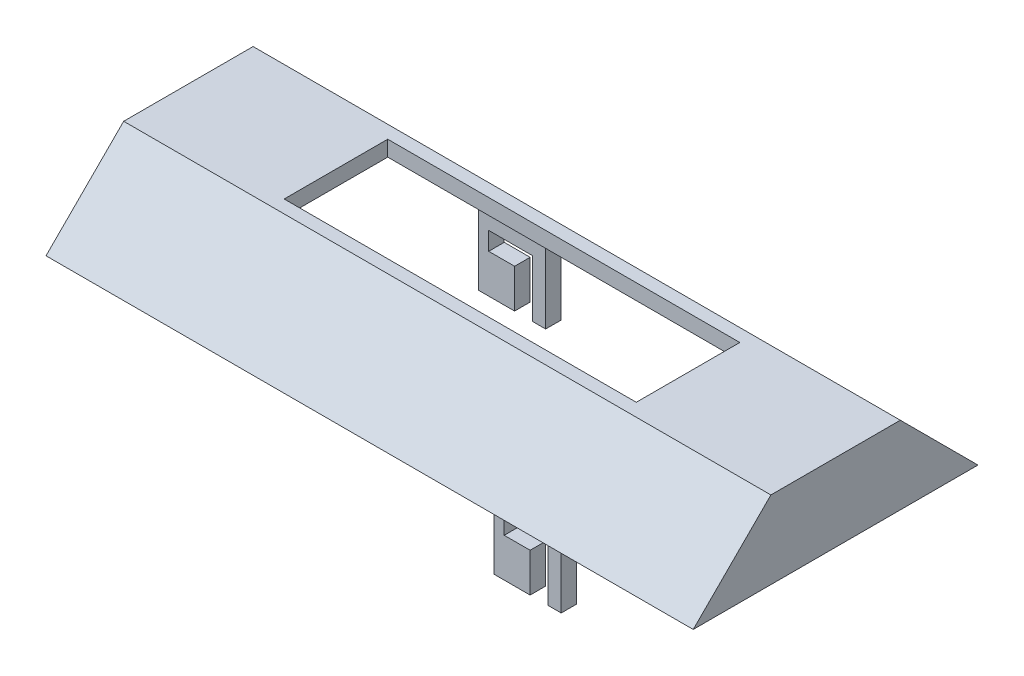
ISO-10303-21;
HEADER;
FILE_DESCRIPTION(('STEP AP214'),'2;1');
FILE_NAME('part.step','',(''),(''),'','','');
FILE_SCHEMA(('AUTOMOTIVE_DESIGN { 1 0 10303 214 1 1 1 1 }'));
ENDSEC;
DATA;
#1=APPLICATION_CONTEXT('core data for automotive mechanical design processes');
#2=APPLICATION_PROTOCOL_DEFINITION('international standard','automotive_design',2000,#1);
#3=PRODUCT_CONTEXT('',#1,'mechanical');
#4=PRODUCT('Part','Part','',(#3));
#5=PRODUCT_RELATED_PRODUCT_CATEGORY('part','',(#4));
#6=PRODUCT_DEFINITION_FORMATION('','',#4);
#7=PRODUCT_DEFINITION_CONTEXT('part definition',#1,'design');
#8=PRODUCT_DEFINITION('design','',#6,#7);
#9=PRODUCT_DEFINITION_SHAPE('','',#8);
#10=(LENGTH_UNIT() NAMED_UNIT(*) SI_UNIT(.MILLI.,.METRE.));
#11=(NAMED_UNIT(*) PLANE_ANGLE_UNIT() SI_UNIT($,.RADIAN.));
#12=(NAMED_UNIT(*) SI_UNIT($,.STERADIAN.) SOLID_ANGLE_UNIT());
#13=UNCERTAINTY_MEASURE_WITH_UNIT(LENGTH_MEASURE(1.E-05),#10,'distance_accuracy_value','');
#14=(GEOMETRIC_REPRESENTATION_CONTEXT(3) GLOBAL_UNCERTAINTY_ASSIGNED_CONTEXT((#13)) GLOBAL_UNIT_ASSIGNED_CONTEXT((#10,
#11,#12)) REPRESENTATION_CONTEXT('',''));
#15=CARTESIAN_POINT('',(0.,0.,0.));
#16=DIRECTION('',(0.,0.,1.));
#17=DIRECTION('',(1.,0.,0.));
#18=AXIS2_PLACEMENT_3D('',#15,#16,#17);
#19=CARTESIAN_POINT('',(0.,12.8786796564404,37.8786796564404));
#20=DIRECTION('',(0.,0.707106781186546,0.707106781186549));
#21=DIRECTION('',(-1.,0.,0.));
#22=AXIS2_PLACEMENT_3D('',#19,#20,#21);
#23=PLANE('',#22);
#24=DIRECTION('',(0.,0.707106781186549,-0.707106781186546));
#25=VECTOR('',#24,1.);
#26=CARTESIAN_POINT('',(83.5,12.8786796564404,37.8786796564404));
#27=LINE('',#26,#25);
#28=CARTESIAN_POINT('',(83.5,0.,50.7573593128807));
#29=VERTEX_POINT('',#28);
#30=CARTESIAN_POINT('',(83.5,1.75735931288066,49.));
#31=VERTEX_POINT('',#30);
#32=EDGE_CURVE('E256',#29,#31,#27,.T.);
#33=ORIENTED_EDGE('',*,*,#32,.F.);
#34=DIRECTION('',(1.,0.,0.));
#35=VECTOR('',#34,1.);
#36=CARTESIAN_POINT('',(0.,0.,50.7573593128807));
#37=LINE('',#36,#35);
#38=CARTESIAN_POINT('',(3.00000000000001,0.,50.7573593128807));
#39=VERTEX_POINT('',#38);
#40=EDGE_CURVE('E258',#39,#29,#37,.T.);
#41=ORIENTED_EDGE('',*,*,#40,.F.);
#42=DIRECTION('',(0.,0.707106781186549,-0.707106781186546));
#43=VECTOR('',#42,1.);
#44=CARTESIAN_POINT('',(3.,12.8786796564404,37.8786796564404));
#45=LINE('',#44,#43);
#46=CARTESIAN_POINT('',(3.,12.,38.7573593128807));
#47=VERTEX_POINT('',#46);
#48=EDGE_CURVE('E338',#39,#47,#45,.T.);
#49=ORIENTED_EDGE('',*,*,#48,.T.);
#50=DIRECTION('',(1.,0.,0.));
#51=VECTOR('',#50,1.);
#52=CARTESIAN_POINT('',(0.,12.,38.7573593128807));
#53=LINE('',#52,#51);
#54=CARTESIAN_POINT('',(122.,12.,38.7573593128807));
#55=VERTEX_POINT('',#54);
#56=EDGE_CURVE('E350',#47,#55,#53,.T.);
#57=ORIENTED_EDGE('',*,*,#56,.T.);
#58=DIRECTION('',(0.,-0.707106781186549,0.707106781186546));
#59=VECTOR('',#58,1.);
#60=CARTESIAN_POINT('',(122.,12.8786796564404,37.8786796564404));
#61=LINE('',#60,#59);
#62=CARTESIAN_POINT('',(122.,0.,50.7573593128807));
#63=VERTEX_POINT('',#62);
#64=EDGE_CURVE('E349',#55,#63,#61,.T.);
#65=ORIENTED_EDGE('',*,*,#64,.T.);
#66=CARTESIAN_POINT('',(96.5,0.,50.7573593128807));
#67=VERTEX_POINT('',#66);
#68=EDGE_CURVE('E278',#67,#63,#37,.T.);
#69=ORIENTED_EDGE('',*,*,#68,.F.);
#70=DIRECTION('',(0.,-0.707106781186549,0.707106781186546));
#71=VECTOR('',#70,1.);
#72=CARTESIAN_POINT('',(96.5,12.8786796564404,37.8786796564404));
#73=LINE('',#72,#71);
#74=CARTESIAN_POINT('',(96.5,1.75735931288066,49.));
#75=VERTEX_POINT('',#74);
#76=EDGE_CURVE('E267',#75,#67,#73,.T.);
#77=ORIENTED_EDGE('',*,*,#76,.F.);
#78=DIRECTION('',(1.,0.,0.));
#79=VECTOR('',#78,1.);
#80=CARTESIAN_POINT('',(0.,1.75735931288066,49.));
#81=LINE('',#80,#79);
#82=EDGE_CURVE('E262',#31,#75,#81,.T.);
#83=ORIENTED_EDGE('',*,*,#82,.F.);
#84=EDGE_LOOP('',(#33,#41,#49,#57,#65,#69,#77,#83));
#85=FACE_BOUND('',#84,.T.);
#86=ADVANCED_FACE('F35',(#85),#23,.F.);
#87=CARTESIAN_POINT('',(0.,12.8786796564404,17.1213203435596));
#88=DIRECTION('',(0.,0.707106781186546,-0.707106781186549));
#89=DIRECTION('',(1.,0.,0.));
#90=AXIS2_PLACEMENT_3D('',#87,#88,#89);
#91=PLANE('',#90);
#92=DIRECTION('',(0.,-0.707106781186549,-0.707106781186546));
#93=VECTOR('',#92,1.);
#94=CARTESIAN_POINT('',(34.5,12.8786796564404,17.1213203435596));
#95=LINE('',#94,#93);
#96=CARTESIAN_POINT('',(34.5,1.75735931288067,6.));
#97=VERTEX_POINT('',#96);
#98=CARTESIAN_POINT('',(34.5,0.,4.24264068711933));
#99=VERTEX_POINT('',#98);
#100=EDGE_CURVE('E510',#97,#99,#95,.T.);
#101=ORIENTED_EDGE('',*,*,#100,.F.);
#102=DIRECTION('',(-1.,0.,0.));
#103=VECTOR('',#102,1.);
#104=CARTESIAN_POINT('',(0.,1.75735931288067,6.));
#105=LINE('',#104,#103);
#106=CARTESIAN_POINT('',(47.5,1.75735931288067,6.));
#107=VERTEX_POINT('',#106);
#108=EDGE_CURVE('E431',#107,#97,#105,.T.);
#109=ORIENTED_EDGE('',*,*,#108,.F.);
#110=DIRECTION('',(0.,0.707106781186549,0.707106781186546));
#111=VECTOR('',#110,1.);
#112=CARTESIAN_POINT('',(47.5,12.8786796564404,17.1213203435596));
#113=LINE('',#112,#111);
#114=CARTESIAN_POINT('',(47.5,0.,4.24264068711933));
#115=VERTEX_POINT('',#114);
#116=EDGE_CURVE('E266',#115,#107,#113,.T.);
#117=ORIENTED_EDGE('',*,*,#116,.F.);
#118=DIRECTION('',(-1.,0.,0.));
#119=VECTOR('',#118,1.);
#120=CARTESIAN_POINT('',(0.,0.,4.24264068711933));
#121=LINE('',#120,#119);
#122=CARTESIAN_POINT('',(122.,0.,4.24264068711933));
#123=VERTEX_POINT('',#122);
#124=EDGE_CURVE('E346',#123,#115,#121,.T.);
#125=ORIENTED_EDGE('',*,*,#124,.F.);
#126=DIRECTION('',(0.,0.707106781186549,0.707106781186546));
#127=VECTOR('',#126,1.);
#128=CARTESIAN_POINT('',(122.,12.8786796564404,17.1213203435596));
#129=LINE('',#128,#127);
#130=CARTESIAN_POINT('',(122.,12.,16.2426406871193));
#131=VERTEX_POINT('',#130);
#132=EDGE_CURVE('E353',#123,#131,#129,.T.);
#133=ORIENTED_EDGE('',*,*,#132,.T.);
#134=DIRECTION('',(-1.,0.,0.));
#135=VECTOR('',#134,1.);
#136=CARTESIAN_POINT('',(0.,12.,16.2426406871193));
#137=LINE('',#136,#135);
#138=CARTESIAN_POINT('',(3.,12.,16.2426406871193));
#139=VERTEX_POINT('',#138);
#140=EDGE_CURVE('E354',#131,#139,#137,.T.);
#141=ORIENTED_EDGE('',*,*,#140,.T.);
#142=DIRECTION('',(0.,-0.707106781186549,-0.707106781186546));
#143=VECTOR('',#142,1.);
#144=CARTESIAN_POINT('',(3.,12.8786796564404,17.1213203435596));
#145=LINE('',#144,#143);
#146=CARTESIAN_POINT('',(3.,0.,4.24264068711933));
#147=VERTEX_POINT('',#146);
#148=EDGE_CURVE('E341',#139,#147,#145,.T.);
#149=ORIENTED_EDGE('',*,*,#148,.T.);
#150=EDGE_CURVE('E365',#99,#147,#121,.T.);
#151=ORIENTED_EDGE('',*,*,#150,.F.);
#152=EDGE_LOOP('',(#101,#109,#117,#125,#133,#141,#149,#151));
#153=FACE_BOUND('',#152,.T.);
#154=ADVANCED_FACE('F579',(#153),#91,.F.);
#155=CARTESIAN_POINT('',(47.5,-13.,6.));
#156=DIRECTION('',(0.,0.,-1.));
#157=DIRECTION('',(-1.,0.,0.));
#158=AXIS2_PLACEMENT_3D('',#155,#156,#157);
#159=PLANE('',#158);
#160=DIRECTION('',(0.,-1.,0.));
#161=VECTOR('',#160,1.);
#162=CARTESIAN_POINT('',(41.5,-13.,6.));
#163=LINE('',#162,#161);
#164=CARTESIAN_POINT('',(41.5,-5.5,6.));
#165=VERTEX_POINT('',#164);
#166=CARTESIAN_POINT('',(41.5,-13.,6.));
#167=VERTEX_POINT('',#166);
#168=EDGE_CURVE('E438',#165,#167,#163,.T.);
#169=ORIENTED_EDGE('',*,*,#168,.F.);
#170=DIRECTION('',(1.,0.,0.));
#171=VECTOR('',#170,1.);
#172=CARTESIAN_POINT('',(47.5,-5.5,6.));
#173=LINE('',#172,#171);
#174=CARTESIAN_POINT('',(36.5,-5.5,6.));
#175=VERTEX_POINT('',#174);
#176=EDGE_CURVE('E441',#175,#165,#173,.T.);
#177=ORIENTED_EDGE('',*,*,#176,.F.);
#178=DIRECTION('',(0.,1.,0.));
#179=VECTOR('',#178,1.);
#180=CARTESIAN_POINT('',(36.5,-13.,6.));
#181=LINE('',#180,#179);
#182=CARTESIAN_POINT('',(36.5,-2.,6.));
#183=VERTEX_POINT('',#182);
#184=EDGE_CURVE('E450',#175,#183,#181,.T.);
#185=ORIENTED_EDGE('',*,*,#184,.T.);
#186=DIRECTION('',(1.,0.,0.));
#187=VECTOR('',#186,1.);
#188=CARTESIAN_POINT('',(47.5,-2.,6.));
#189=LINE('',#188,#187);
#190=CARTESIAN_POINT('',(45.,-2.,6.));
#191=VERTEX_POINT('',#190);
#192=EDGE_CURVE('E436',#183,#191,#189,.T.);
#193=ORIENTED_EDGE('',*,*,#192,.T.);
#194=DIRECTION('',(0.,-1.,0.));
#195=VECTOR('',#194,1.);
#196=CARTESIAN_POINT('',(45.,-13.,6.));
#197=LINE('',#196,#195);
#198=CARTESIAN_POINT('',(45.,-13.,6.));
#199=VERTEX_POINT('',#198);
#200=EDGE_CURVE('E434',#191,#199,#197,.T.);
#201=ORIENTED_EDGE('',*,*,#200,.T.);
#202=DIRECTION('',(-1.,0.,0.));
#203=VECTOR('',#202,1.);
#204=CARTESIAN_POINT('',(47.5,-13.,6.));
#205=LINE('',#204,#203);
#206=CARTESIAN_POINT('',(47.5,-13.,6.));
#207=VERTEX_POINT('',#206);
#208=EDGE_CURVE('E310',#207,#199,#205,.T.);
#209=ORIENTED_EDGE('',*,*,#208,.F.);
#210=DIRECTION('',(0.,1.,0.));
#211=VECTOR('',#210,1.);
#212=CARTESIAN_POINT('',(47.5,-13.,6.));
#213=LINE('',#212,#211);
#214=EDGE_CURVE('E336',#207,#107,#213,.T.);
#215=ORIENTED_EDGE('',*,*,#214,.T.);
#216=ORIENTED_EDGE('',*,*,#108,.T.);
#217=DIRECTION('',(0.,1.,0.));
#218=VECTOR('',#217,1.);
#219=CARTESIAN_POINT('',(34.5,-13.,6.));
#220=LINE('',#219,#218);
#221=CARTESIAN_POINT('',(34.5,-13.,6.));
#222=VERTEX_POINT('',#221);
#223=EDGE_CURVE('E334',#222,#97,#220,.T.);
#224=ORIENTED_EDGE('',*,*,#223,.F.);
#225=EDGE_CURVE('E308',#167,#222,#205,.T.);
#226=ORIENTED_EDGE('',*,*,#225,.F.);
#227=EDGE_LOOP('',(#169,#177,#185,#193,#201,#209,#215,#216,#224,#226));
#228=FACE_BOUND('',#227,.T.);
#229=ADVANCED_FACE('F429',(#228),#159,.F.);
#230=CARTESIAN_POINT('',(47.5,-13.,3.));
#231=DIRECTION('',(0.,0.,1.));
#232=DIRECTION('',(1.,0.,0.));
#233=AXIS2_PLACEMENT_3D('',#230,#231,#232);
#234=PLANE('',#233);
#235=DIRECTION('',(0.,-1.,0.));
#236=VECTOR('',#235,1.);
#237=CARTESIAN_POINT('',(41.5,0.,3.));
#238=LINE('',#237,#236);
#239=CARTESIAN_POINT('',(41.5,-5.5,3.));
#240=VERTEX_POINT('',#239);
#241=CARTESIAN_POINT('',(41.5,-13.,3.));
#242=VERTEX_POINT('',#241);
#243=EDGE_CURVE('E535',#240,#242,#238,.T.);
#244=ORIENTED_EDGE('',*,*,#243,.T.);
#245=DIRECTION('',(1.,0.,0.));
#246=VECTOR('',#245,1.);
#247=CARTESIAN_POINT('',(47.5,-13.,3.));
#248=LINE('',#247,#246);
#249=CARTESIAN_POINT('',(34.5,-13.,3.));
#250=VERTEX_POINT('',#249);
#251=EDGE_CURVE('E316',#250,#242,#248,.T.);
#252=ORIENTED_EDGE('',*,*,#251,.F.);
#253=DIRECTION('',(0.,1.,0.));
#254=VECTOR('',#253,1.);
#255=CARTESIAN_POINT('',(34.5,-13.,3.));
#256=LINE('',#255,#254);
#257=CARTESIAN_POINT('',(34.5,0.,3.));
#258=VERTEX_POINT('',#257);
#259=EDGE_CURVE('E331',#250,#258,#256,.T.);
#260=ORIENTED_EDGE('',*,*,#259,.T.);
#261=DIRECTION('',(1.,0.,0.));
#262=VECTOR('',#261,1.);
#263=CARTESIAN_POINT('',(47.5,0.,3.));
#264=LINE('',#263,#262);
#265=CARTESIAN_POINT('',(47.5,0.,3.));
#266=VERTEX_POINT('',#265);
#267=EDGE_CURVE('E309',#258,#266,#264,.T.);
#268=ORIENTED_EDGE('',*,*,#267,.T.);
#269=DIRECTION('',(0.,1.,0.));
#270=VECTOR('',#269,1.);
#271=CARTESIAN_POINT('',(47.5,-13.,3.));
#272=LINE('',#271,#270);
#273=CARTESIAN_POINT('',(47.5,-13.,3.));
#274=VERTEX_POINT('',#273);
#275=EDGE_CURVE('E319',#274,#266,#272,.T.);
#276=ORIENTED_EDGE('',*,*,#275,.F.);
#277=CARTESIAN_POINT('',(45.,-13.,3.));
#278=VERTEX_POINT('',#277);
#279=EDGE_CURVE('E315',#278,#274,#248,.T.);
#280=ORIENTED_EDGE('',*,*,#279,.F.);
#281=DIRECTION('',(0.,-1.,0.));
#282=VECTOR('',#281,1.);
#283=CARTESIAN_POINT('',(45.,0.,3.));
#284=LINE('',#283,#282);
#285=CARTESIAN_POINT('',(45.,-2.,3.));
#286=VERTEX_POINT('',#285);
#287=EDGE_CURVE('E419',#286,#278,#284,.T.);
#288=ORIENTED_EDGE('',*,*,#287,.F.);
#289=DIRECTION('',(1.,0.,0.));
#290=VECTOR('',#289,1.);
#291=CARTESIAN_POINT('',(0.,-2.,3.));
#292=LINE('',#291,#290);
#293=CARTESIAN_POINT('',(36.5,-2.,3.));
#294=VERTEX_POINT('',#293);
#295=EDGE_CURVE('E548',#294,#286,#292,.T.);
#296=ORIENTED_EDGE('',*,*,#295,.F.);
#297=DIRECTION('',(0.,1.,0.));
#298=VECTOR('',#297,1.);
#299=CARTESIAN_POINT('',(36.5,0.,3.));
#300=LINE('',#299,#298);
#301=CARTESIAN_POINT('',(36.5,-5.5,3.));
#302=VERTEX_POINT('',#301);
#303=EDGE_CURVE('E545',#302,#294,#300,.T.);
#304=ORIENTED_EDGE('',*,*,#303,.F.);
#305=DIRECTION('',(1.,0.,0.));
#306=VECTOR('',#305,1.);
#307=CARTESIAN_POINT('',(0.,-5.5,3.));
#308=LINE('',#307,#306);
#309=EDGE_CURVE('E542',#302,#240,#308,.T.);
#310=ORIENTED_EDGE('',*,*,#309,.T.);
#311=EDGE_LOOP('',(#244,#252,#260,#268,#276,#280,#288,#296,#304,#310));
#312=FACE_BOUND('',#311,.T.);
#313=ADVANCED_FACE('F417',(#312),#234,.F.);
#314=CARTESIAN_POINT('',(0.,-13.,0.));
#315=DIRECTION('',(0.,1.,0.));
#316=DIRECTION('',(0.,0.,1.));
#317=AXIS2_PLACEMENT_3D('',#314,#315,#316);
#318=PLANE('',#317);
#319=DIRECTION('',(0.,0.,-1.));
#320=VECTOR('',#319,1.);
#321=CARTESIAN_POINT('',(41.5,-13.,0.));
#322=LINE('',#321,#320);
#323=EDGE_CURVE('E11',#167,#242,#322,.T.);
#324=ORIENTED_EDGE('',*,*,#323,.F.);
#325=ORIENTED_EDGE('',*,*,#225,.T.);
#326=DIRECTION('',(0.,0.,-1.));
#327=VECTOR('',#326,1.);
#328=CARTESIAN_POINT('',(34.5,-13.,6.));
#329=LINE('',#328,#327);
#330=EDGE_CURVE('E313',#222,#250,#329,.T.);
#331=ORIENTED_EDGE('',*,*,#330,.T.);
#332=ORIENTED_EDGE('',*,*,#251,.T.);
#333=EDGE_LOOP('',(#324,#325,#331,#332));
#334=FACE_BOUND('',#333,.T.);
#335=ADVANCED_FACE('F571',(#334),#318,.F.);
#336=CARTESIAN_POINT('',(96.5,-13.,52.));
#337=DIRECTION('',(0.,0.,-1.));
#338=DIRECTION('',(-1.,0.,0.));
#339=AXIS2_PLACEMENT_3D('',#336,#337,#338);
#340=PLANE('',#339);
#341=DIRECTION('',(0.,-1.,0.));
#342=VECTOR('',#341,1.);
#343=CARTESIAN_POINT('',(94.,1.73934940524608E-13,52.));
#344=LINE('',#343,#342);
#345=CARTESIAN_POINT('',(94.,-2.,52.));
#346=VERTEX_POINT('',#345);
#347=CARTESIAN_POINT('',(94.,-13.,52.));
#348=VERTEX_POINT('',#347);
#349=EDGE_CURVE('E453',#346,#348,#344,.T.);
#350=ORIENTED_EDGE('',*,*,#349,.T.);
#351=DIRECTION('',(-1.,0.,0.));
#352=VECTOR('',#351,1.);
#353=CARTESIAN_POINT('',(96.5,-13.,52.));
#354=LINE('',#353,#352);
#355=CARTESIAN_POINT('',(96.5,-13.,52.));
#356=VERTEX_POINT('',#355);
#357=EDGE_CURVE('E480',#356,#348,#354,.T.);
#358=ORIENTED_EDGE('',*,*,#357,.F.);
#359=DIRECTION('',(0.,1.,0.));
#360=VECTOR('',#359,1.);
#361=CARTESIAN_POINT('',(96.5,-13.,52.));
#362=LINE('',#361,#360);
#363=CARTESIAN_POINT('',(96.5,0.,52.));
#364=VERTEX_POINT('',#363);
#365=EDGE_CURVE('E301',#356,#364,#362,.T.);
#366=ORIENTED_EDGE('',*,*,#365,.T.);
#367=DIRECTION('',(-1.,0.,0.));
#368=VECTOR('',#367,1.);
#369=CARTESIAN_POINT('',(96.5,0.,52.));
#370=LINE('',#369,#368);
#371=CARTESIAN_POINT('',(83.5,0.,52.));
#372=VERTEX_POINT('',#371);
#373=EDGE_CURVE('E286',#364,#372,#370,.T.);
#374=ORIENTED_EDGE('',*,*,#373,.T.);
#375=DIRECTION('',(0.,1.,0.));
#376=VECTOR('',#375,1.);
#377=CARTESIAN_POINT('',(83.5,-13.,52.));
#378=LINE('',#377,#376);
#379=CARTESIAN_POINT('',(83.5,-13.,52.));
#380=VERTEX_POINT('',#379);
#381=EDGE_CURVE('E284',#380,#372,#378,.T.);
#382=ORIENTED_EDGE('',*,*,#381,.F.);
#383=CARTESIAN_POINT('',(90.5,-13.,52.));
#384=VERTEX_POINT('',#383);
#385=EDGE_CURVE('E289',#384,#380,#354,.T.);
#386=ORIENTED_EDGE('',*,*,#385,.F.);
#387=DIRECTION('',(0.,-1.,0.));
#388=VECTOR('',#387,1.);
#389=CARTESIAN_POINT('',(90.5,0.,52.));
#390=LINE('',#389,#388);
#391=CARTESIAN_POINT('',(90.5,-5.5,52.));
#392=VERTEX_POINT('',#391);
#393=EDGE_CURVE('E465',#392,#384,#390,.T.);
#394=ORIENTED_EDGE('',*,*,#393,.F.);
#395=DIRECTION('',(-1.,0.,0.));
#396=VECTOR('',#395,1.);
#397=CARTESIAN_POINT('',(0.,-5.50000000000001,52.));
#398=LINE('',#397,#396);
#399=CARTESIAN_POINT('',(85.5,-5.5,52.));
#400=VERTEX_POINT('',#399);
#401=EDGE_CURVE('E462',#392,#400,#398,.T.);
#402=ORIENTED_EDGE('',*,*,#401,.T.);
#403=DIRECTION('',(0.,1.,0.));
#404=VECTOR('',#403,1.);
#405=CARTESIAN_POINT('',(85.5,0.,52.));
#406=LINE('',#405,#404);
#407=CARTESIAN_POINT('',(85.5,-2.,52.));
#408=VERTEX_POINT('',#407);
#409=EDGE_CURVE('E459',#400,#408,#406,.T.);
#410=ORIENTED_EDGE('',*,*,#409,.T.);
#411=DIRECTION('',(-1.,0.,0.));
#412=VECTOR('',#411,1.);
#413=CARTESIAN_POINT('',(0.,-2.00000000000001,52.));
#414=LINE('',#413,#412);
#415=EDGE_CURVE('E456',#346,#408,#414,.T.);
#416=ORIENTED_EDGE('',*,*,#415,.F.);
#417=EDGE_LOOP('',(#350,#358,#366,#374,#382,#386,#394,#402,#410,#416));
#418=FACE_BOUND('',#417,.T.);
#419=ADVANCED_FACE('F494',(#418),#340,.F.);
#420=CARTESIAN_POINT('',(96.5,-13.,49.));
#421=DIRECTION('',(0.,0.,1.));
#422=DIRECTION('',(1.,0.,0.));
#423=AXIS2_PLACEMENT_3D('',#420,#421,#422);
#424=PLANE('',#423);
#425=DIRECTION('',(0.,-1.,0.));
#426=VECTOR('',#425,1.);
#427=CARTESIAN_POINT('',(94.,-13.,49.));
#428=LINE('',#427,#426);
#429=CARTESIAN_POINT('',(94.,-2.,49.));
#430=VERTEX_POINT('',#429);
#431=CARTESIAN_POINT('',(94.,-13.,49.));
#432=VERTEX_POINT('',#431);
#433=EDGE_CURVE('E478',#430,#432,#428,.T.);
#434=ORIENTED_EDGE('',*,*,#433,.F.);
#435=DIRECTION('',(-1.,0.,0.));
#436=VECTOR('',#435,1.);
#437=CARTESIAN_POINT('',(96.5,-2.,49.));
#438=LINE('',#437,#436);
#439=CARTESIAN_POINT('',(85.5,-2.,49.));
#440=VERTEX_POINT('',#439);
#441=EDGE_CURVE('E401',#430,#440,#438,.T.);
#442=ORIENTED_EDGE('',*,*,#441,.T.);
#443=DIRECTION('',(0.,1.,0.));
#444=VECTOR('',#443,1.);
#445=CARTESIAN_POINT('',(85.5,-13.,49.));
#446=LINE('',#445,#444);
#447=CARTESIAN_POINT('',(85.5,-5.5,49.));
#448=VERTEX_POINT('',#447);
#449=EDGE_CURVE('E404',#448,#440,#446,.T.);
#450=ORIENTED_EDGE('',*,*,#449,.F.);
#451=DIRECTION('',(-1.,0.,0.));
#452=VECTOR('',#451,1.);
#453=CARTESIAN_POINT('',(96.5,-5.5,49.));
#454=LINE('',#453,#452);
#455=CARTESIAN_POINT('',(90.5,-5.5,49.));
#456=VERTEX_POINT('',#455);
#457=EDGE_CURVE('E406',#456,#448,#454,.T.);
#458=ORIENTED_EDGE('',*,*,#457,.F.);
#459=DIRECTION('',(0.,-1.,0.));
#460=VECTOR('',#459,1.);
#461=CARTESIAN_POINT('',(90.5,-13.,49.));
#462=LINE('',#461,#460);
#463=CARTESIAN_POINT('',(90.5,-13.,49.));
#464=VERTEX_POINT('',#463);
#465=EDGE_CURVE('E470',#456,#464,#462,.T.);
#466=ORIENTED_EDGE('',*,*,#465,.T.);
#467=DIRECTION('',(1.,0.,0.));
#468=VECTOR('',#467,1.);
#469=CARTESIAN_POINT('',(96.5,-13.,49.));
#470=LINE('',#469,#468);
#471=CARTESIAN_POINT('',(83.5,-13.,49.));
#472=VERTEX_POINT('',#471);
#473=EDGE_CURVE('E298',#472,#464,#470,.T.);
#474=ORIENTED_EDGE('',*,*,#473,.F.);
#475=DIRECTION('',(0.,1.,0.));
#476=VECTOR('',#475,1.);
#477=CARTESIAN_POINT('',(83.5,-13.,49.));
#478=LINE('',#477,#476);
#479=EDGE_CURVE('E297',#472,#31,#478,.T.);
#480=ORIENTED_EDGE('',*,*,#479,.T.);
#481=ORIENTED_EDGE('',*,*,#82,.T.);
#482=DIRECTION('',(0.,1.,0.));
#483=VECTOR('',#482,1.);
#484=CARTESIAN_POINT('',(96.5,-13.,49.));
#485=LINE('',#484,#483);
#486=CARTESIAN_POINT('',(96.5,-13.,49.));
#487=VERTEX_POINT('',#486);
#488=EDGE_CURVE('E295',#487,#75,#485,.T.);
#489=ORIENTED_EDGE('',*,*,#488,.F.);
#490=EDGE_CURVE('E485',#432,#487,#470,.T.);
#491=ORIENTED_EDGE('',*,*,#490,.F.);
#492=EDGE_LOOP('',(#434,#442,#450,#458,#466,#474,#480,#481,#489,#491));
#493=FACE_BOUND('',#492,.T.);
#494=ADVANCED_FACE('F503',(#493),#424,.F.);
#495=CARTESIAN_POINT('',(0.,-13.,0.));
#496=DIRECTION('',(0.,-1.,0.));
#497=DIRECTION('',(0.,0.,-1.));
#498=AXIS2_PLACEMENT_3D('',#495,#496,#497);
#499=PLANE('',#498);
#500=ORIENTED_EDGE('',*,*,#357,.T.);
#501=DIRECTION('',(0.,0.,-1.));
#502=VECTOR('',#501,1.);
#503=CARTESIAN_POINT('',(94.,-13.,0.));
#504=LINE('',#503,#502);
#505=EDGE_CURVE('E398',#348,#432,#504,.T.);
#506=ORIENTED_EDGE('',*,*,#505,.T.);
#507=ORIENTED_EDGE('',*,*,#490,.T.);
#508=DIRECTION('',(0.,0.,1.));
#509=VECTOR('',#508,1.);
#510=CARTESIAN_POINT('',(96.5,-13.,49.));
#511=LINE('',#510,#509);
#512=EDGE_CURVE('E285',#487,#356,#511,.T.);
#513=ORIENTED_EDGE('',*,*,#512,.T.);
#514=EDGE_LOOP('',(#500,#506,#507,#513));
#515=FACE_BOUND('',#514,.T.);
#516=ADVANCED_FACE('F498',(#515),#499,.T.);
#517=CARTESIAN_POINT('',(0.,0.,0.));
#518=DIRECTION('',(0.,1.,0.));
#519=DIRECTION('',(0.,0.,1.));
#520=AXIS2_PLACEMENT_3D('',#517,#518,#519);
#521=PLANE('',#520);
#522=DIRECTION('',(0.,0.,1.));
#523=VECTOR('',#522,1.);
#524=CARTESIAN_POINT('',(0.,0.,0.));
#525=LINE('',#524,#523);
#526=CARTESIAN_POINT('',(0.,0.,0.));
#527=VERTEX_POINT('',#526);
#528=CARTESIAN_POINT('',(0.,0.,55.));
#529=VERTEX_POINT('',#528);
#530=EDGE_CURVE('E340',#527,#529,#525,.T.);
#531=ORIENTED_EDGE('',*,*,#530,.F.);
#532=DIRECTION('',(-1.,0.,0.));
#533=VECTOR('',#532,1.);
#534=CARTESIAN_POINT('',(0.,0.,0.));
#535=LINE('',#534,#533);
#536=CARTESIAN_POINT('',(125.,0.,0.));
#537=VERTEX_POINT('',#536);
#538=EDGE_CURVE('E372',#537,#527,#535,.T.);
#539=ORIENTED_EDGE('',*,*,#538,.F.);
#540=DIRECTION('',(0.,0.,-1.));
#541=VECTOR('',#540,1.);
#542=CARTESIAN_POINT('',(125.,0.,0.));
#543=LINE('',#542,#541);
#544=CARTESIAN_POINT('',(125.,0.,55.));
#545=VERTEX_POINT('',#544);
#546=EDGE_CURVE('E381',#545,#537,#543,.T.);
#547=ORIENTED_EDGE('',*,*,#546,.F.);
#548=DIRECTION('',(1.,0.,0.));
#549=VECTOR('',#548,1.);
#550=CARTESIAN_POINT('',(0.,0.,55.));
#551=LINE('',#550,#549);
#552=EDGE_CURVE('E378',#529,#545,#551,.T.);
#553=ORIENTED_EDGE('',*,*,#552,.F.);
#554=EDGE_LOOP('',(#531,#539,#547,#553));
#555=FACE_BOUND('',#554,.T.);
#556=DIRECTION('',(0.,0.,1.));
#557=VECTOR('',#556,1.);
#558=CARTESIAN_POINT('',(96.5,0.,49.));
#559=LINE('',#558,#557);
#560=EDGE_CURVE('E291',#67,#364,#559,.T.);
#561=ORIENTED_EDGE('',*,*,#560,.F.);
#562=ORIENTED_EDGE('',*,*,#68,.T.);
#563=DIRECTION('',(0.,0.,-1.));
#564=VECTOR('',#563,1.);
#565=CARTESIAN_POINT('',(122.,0.,0.));
#566=LINE('',#565,#564);
#567=EDGE_CURVE('E277',#63,#123,#566,.T.);
#568=ORIENTED_EDGE('',*,*,#567,.T.);
#569=ORIENTED_EDGE('',*,*,#124,.T.);
#570=DIRECTION('',(0.,0.,1.));
#571=VECTOR('',#570,1.);
#572=CARTESIAN_POINT('',(47.5,0.,6.));
#573=LINE('',#572,#571);
#574=EDGE_CURVE('E304',#266,#115,#573,.T.);
#575=ORIENTED_EDGE('',*,*,#574,.F.);
#576=ORIENTED_EDGE('',*,*,#267,.F.);
#577=DIRECTION('',(0.,0.,-1.));
#578=VECTOR('',#577,1.);
#579=CARTESIAN_POINT('',(34.5,0.,6.));
#580=LINE('',#579,#578);
#581=EDGE_CURVE('E322',#99,#258,#580,.T.);
#582=ORIENTED_EDGE('',*,*,#581,.F.);
#583=ORIENTED_EDGE('',*,*,#150,.T.);
#584=DIRECTION('',(0.,0.,1.));
#585=VECTOR('',#584,1.);
#586=CARTESIAN_POINT('',(3.,0.,0.));
#587=LINE('',#586,#585);
#588=EDGE_CURVE('E276',#147,#39,#587,.T.);
#589=ORIENTED_EDGE('',*,*,#588,.T.);
#590=ORIENTED_EDGE('',*,*,#40,.T.);
#591=DIRECTION('',(0.,0.,-1.));
#592=VECTOR('',#591,1.);
#593=CARTESIAN_POINT('',(83.5,0.,49.));
#594=LINE('',#593,#592);
#595=EDGE_CURVE('E273',#372,#29,#594,.T.);
#596=ORIENTED_EDGE('',*,*,#595,.F.);
#597=ORIENTED_EDGE('',*,*,#373,.F.);
#598=EDGE_LOOP('',(#561,#562,#568,#569,#575,#576,#582,#583,#589,#590,#596,#597));
#599=FACE_BOUND('',#598,.T.);
#600=ADVANCED_FACE('F272',(#555,#599),#521,.F.);
#601=CARTESIAN_POINT('',(0.,15.,0.));
#602=DIRECTION('',(1.,0.,0.));
#603=DIRECTION('',(0.,0.,-1.));
#604=AXIS2_PLACEMENT_3D('',#601,#602,#603);
#605=PLANE('',#604);
#606=ORIENTED_EDGE('',*,*,#530,.T.);
#607=DIRECTION('',(0.,0.707106781186549,-0.707106781186546));
#608=VECTOR('',#607,1.);
#609=CARTESIAN_POINT('',(0.,15.,40.));
#610=LINE('',#609,#608);
#611=CARTESIAN_POINT('',(0.,15.,40.));
#612=VERTEX_POINT('',#611);
#613=EDGE_CURVE('E326',#529,#612,#610,.T.);
#614=ORIENTED_EDGE('',*,*,#613,.T.);
#615=DIRECTION('',(0.,0.,1.));
#616=VECTOR('',#615,1.);
#617=CARTESIAN_POINT('',(0.,15.,0.));
#618=LINE('',#617,#616);
#619=CARTESIAN_POINT('',(0.,15.,15.));
#620=VERTEX_POINT('',#619);
#621=EDGE_CURVE('E368',#620,#612,#618,.T.);
#622=ORIENTED_EDGE('',*,*,#621,.F.);
#623=DIRECTION('',(0.,-0.707106781186549,-0.707106781186546));
#624=VECTOR('',#623,1.);
#625=CARTESIAN_POINT('',(0.,15.,15.));
#626=LINE('',#625,#624);
#627=EDGE_CURVE('E394',#620,#527,#626,.T.);
#628=ORIENTED_EDGE('',*,*,#627,.T.);
#629=EDGE_LOOP('',(#606,#614,#622,#628));
#630=FACE_BOUND('',#629,.T.);
#631=ADVANCED_FACE('F618',(#630),#605,.F.);
#632=CARTESIAN_POINT('',(125.,15.,0.));
#633=DIRECTION('',(-1.,0.,0.));
#634=DIRECTION('',(0.,0.,1.));
#635=AXIS2_PLACEMENT_3D('',#632,#633,#634);
#636=PLANE('',#635);
#637=DIRECTION('',(0.,0.,-1.));
#638=VECTOR('',#637,1.);
#639=CARTESIAN_POINT('',(125.,15.,0.));
#640=LINE('',#639,#638);
#641=CARTESIAN_POINT('',(125.,15.,40.));
#642=VERTEX_POINT('',#641);
#643=CARTESIAN_POINT('',(125.,15.,15.));
#644=VERTEX_POINT('',#643);
#645=EDGE_CURVE('E371',#642,#644,#640,.T.);
#646=ORIENTED_EDGE('',*,*,#645,.F.);
#647=DIRECTION('',(0.,-0.707106781186549,0.707106781186546));
#648=VECTOR('',#647,1.);
#649=CARTESIAN_POINT('',(125.,15.,40.));
#650=LINE('',#649,#648);
#651=EDGE_CURVE('E392',#642,#545,#650,.T.);
#652=ORIENTED_EDGE('',*,*,#651,.T.);
#653=ORIENTED_EDGE('',*,*,#546,.T.);
#654=DIRECTION('',(0.,0.707106781186549,0.707106781186546));
#655=VECTOR('',#654,1.);
#656=CARTESIAN_POINT('',(125.,15.,15.));
#657=LINE('',#656,#655);
#658=EDGE_CURVE('E390',#537,#644,#657,.T.);
#659=ORIENTED_EDGE('',*,*,#658,.T.);
#660=EDGE_LOOP('',(#646,#652,#653,#659));
#661=FACE_BOUND('',#660,.T.);
#662=ADVANCED_FACE('F614',(#661),#636,.F.);
#663=CARTESIAN_POINT('',(0.,15.,0.));
#664=DIRECTION('',(0.,1.,0.));
#665=DIRECTION('',(0.,0.,1.));
#666=AXIS2_PLACEMENT_3D('',#663,#664,#665);
#667=PLANE('',#666);
#668=DIRECTION('',(0.,0.,1.));
#669=VECTOR('',#668,1.);
#670=CARTESIAN_POINT('',(28.5,15.,17.5));
#671=LINE('',#670,#669);
#672=CARTESIAN_POINT('',(28.5,15.,17.5));
#673=VERTEX_POINT('',#672);
#674=CARTESIAN_POINT('',(28.5,15.,37.5));
#675=VERTEX_POINT('',#674);
#676=EDGE_CURVE('E59',#673,#675,#671,.T.);
#677=ORIENTED_EDGE('',*,*,#676,.F.);
#678=DIRECTION('',(-1.,0.,0.));
#679=VECTOR('',#678,1.);
#680=CARTESIAN_POINT('',(28.5,15.,17.5));
#681=LINE('',#680,#679);
#682=CARTESIAN_POINT('',(96.5,15.,17.5));
#683=VERTEX_POINT('',#682);
#684=EDGE_CURVE('E516',#683,#673,#681,.T.);
#685=ORIENTED_EDGE('',*,*,#684,.F.);
#686=DIRECTION('',(0.,0.,-1.));
#687=VECTOR('',#686,1.);
#688=CARTESIAN_POINT('',(96.5,15.,17.5));
#689=LINE('',#688,#687);
#690=CARTESIAN_POINT('',(96.5,15.,37.5));
#691=VERTEX_POINT('',#690);
#692=EDGE_CURVE('E528',#691,#683,#689,.T.);
#693=ORIENTED_EDGE('',*,*,#692,.F.);
#694=DIRECTION('',(1.,0.,0.));
#695=VECTOR('',#694,1.);
#696=CARTESIAN_POINT('',(28.5,15.,37.5));
#697=LINE('',#696,#695);
#698=EDGE_CURVE('E525',#675,#691,#697,.T.);
#699=ORIENTED_EDGE('',*,*,#698,.F.);
#700=EDGE_LOOP('',(#677,#685,#693,#699));
#701=FACE_BOUND('',#700,.T.);
#702=ORIENTED_EDGE('',*,*,#621,.T.);
#703=DIRECTION('',(1.,0.,0.));
#704=VECTOR('',#703,1.);
#705=CARTESIAN_POINT('',(125.,15.,40.));
#706=LINE('',#705,#704);
#707=EDGE_CURVE('E387',#612,#642,#706,.T.);
#708=ORIENTED_EDGE('',*,*,#707,.T.);
#709=ORIENTED_EDGE('',*,*,#645,.T.);
#710=DIRECTION('',(-1.,0.,0.));
#711=VECTOR('',#710,1.);
#712=CARTESIAN_POINT('',(0.,15.,15.));
#713=LINE('',#712,#711);
#714=EDGE_CURVE('E375',#644,#620,#713,.T.);
#715=ORIENTED_EDGE('',*,*,#714,.T.);
#716=EDGE_LOOP('',(#702,#708,#709,#715));
#717=FACE_BOUND('',#716,.T.);
#718=ADVANCED_FACE('F610',(#701,#717),#667,.T.);
#719=CARTESIAN_POINT('',(0.,15.,40.));
#720=DIRECTION('',(0.,0.707106781186546,0.707106781186549));
#721=DIRECTION('',(-1.,0.,0.));
#722=AXIS2_PLACEMENT_3D('',#719,#720,#721);
#723=PLANE('',#722);
#724=ORIENTED_EDGE('',*,*,#613,.F.);
#725=ORIENTED_EDGE('',*,*,#552,.T.);
#726=ORIENTED_EDGE('',*,*,#651,.F.);
#727=ORIENTED_EDGE('',*,*,#707,.F.);
#728=EDGE_LOOP('',(#724,#725,#726,#727));
#729=FACE_BOUND('',#728,.T.);
#730=ADVANCED_FACE('F613',(#729),#723,.T.);
#731=CARTESIAN_POINT('',(0.,15.,15.));
#732=DIRECTION('',(0.,0.707106781186546,-0.707106781186549));
#733=DIRECTION('',(1.,0.,0.));
#734=AXIS2_PLACEMENT_3D('',#731,#732,#733);
#735=PLANE('',#734);
#736=ORIENTED_EDGE('',*,*,#658,.F.);
#737=ORIENTED_EDGE('',*,*,#538,.T.);
#738=ORIENTED_EDGE('',*,*,#627,.F.);
#739=ORIENTED_EDGE('',*,*,#714,.F.);
#740=EDGE_LOOP('',(#736,#737,#738,#739));
#741=FACE_BOUND('',#740,.T.);
#742=ADVANCED_FACE('F38',(#741),#735,.T.);
#743=CARTESIAN_POINT('',(3.,15.,0.));
#744=DIRECTION('',(1.,0.,0.));
#745=DIRECTION('',(0.,0.,-1.));
#746=AXIS2_PLACEMENT_3D('',#743,#744,#745);
#747=PLANE('',#746);
#748=ORIENTED_EDGE('',*,*,#588,.F.);
#749=ORIENTED_EDGE('',*,*,#148,.F.);
#750=DIRECTION('',(0.,0.,1.));
#751=VECTOR('',#750,1.);
#752=CARTESIAN_POINT('',(3.,12.,0.));
#753=LINE('',#752,#751);
#754=EDGE_CURVE('E342',#139,#47,#753,.T.);
#755=ORIENTED_EDGE('',*,*,#754,.T.);
#756=ORIENTED_EDGE('',*,*,#48,.F.);
#757=EDGE_LOOP('',(#748,#749,#755,#756));
#758=FACE_BOUND('',#757,.T.);
#759=ADVANCED_FACE('F583',(#758),#747,.T.);
#760=CARTESIAN_POINT('',(122.,15.,0.));
#761=DIRECTION('',(-1.,0.,0.));
#762=DIRECTION('',(0.,0.,1.));
#763=AXIS2_PLACEMENT_3D('',#760,#761,#762);
#764=PLANE('',#763);
#765=DIRECTION('',(0.,0.,-1.));
#766=VECTOR('',#765,1.);
#767=CARTESIAN_POINT('',(122.,12.,0.));
#768=LINE('',#767,#766);
#769=EDGE_CURVE('E345',#55,#131,#768,.T.);
#770=ORIENTED_EDGE('',*,*,#769,.T.);
#771=ORIENTED_EDGE('',*,*,#132,.F.);
#772=ORIENTED_EDGE('',*,*,#567,.F.);
#773=ORIENTED_EDGE('',*,*,#64,.F.);
#774=EDGE_LOOP('',(#770,#771,#772,#773));
#775=FACE_BOUND('',#774,.T.);
#776=ADVANCED_FACE('F590',(#775),#764,.T.);
#777=CARTESIAN_POINT('',(0.,12.,0.));
#778=DIRECTION('',(0.,1.,0.));
#779=DIRECTION('',(0.,0.,1.));
#780=AXIS2_PLACEMENT_3D('',#777,#778,#779);
#781=PLANE('',#780);
#782=DIRECTION('',(-1.,0.,0.));
#783=VECTOR('',#782,1.);
#784=CARTESIAN_POINT('',(28.5,12.,17.5));
#785=LINE('',#784,#783);
#786=CARTESIAN_POINT('',(96.5,12.,17.5));
#787=VERTEX_POINT('',#786);
#788=CARTESIAN_POINT('',(28.5,12.,17.5));
#789=VERTEX_POINT('',#788);
#790=EDGE_CURVE('E520',#787,#789,#785,.T.);
#791=ORIENTED_EDGE('',*,*,#790,.T.);
#792=DIRECTION('',(0.,0.,1.));
#793=VECTOR('',#792,1.);
#794=CARTESIAN_POINT('',(28.5,12.,17.5));
#795=LINE('',#794,#793);
#796=CARTESIAN_POINT('',(28.5,12.,37.5));
#797=VERTEX_POINT('',#796);
#798=EDGE_CURVE('E512',#789,#797,#795,.T.);
#799=ORIENTED_EDGE('',*,*,#798,.T.);
#800=DIRECTION('',(1.,0.,0.));
#801=VECTOR('',#800,1.);
#802=CARTESIAN_POINT('',(28.5,12.,37.5));
#803=LINE('',#802,#801);
#804=CARTESIAN_POINT('',(96.5,12.,37.5));
#805=VERTEX_POINT('',#804);
#806=EDGE_CURVE('E515',#797,#805,#803,.T.);
#807=ORIENTED_EDGE('',*,*,#806,.T.);
#808=DIRECTION('',(0.,0.,-1.));
#809=VECTOR('',#808,1.);
#810=CARTESIAN_POINT('',(96.5,12.,17.5));
#811=LINE('',#810,#809);
#812=EDGE_CURVE('E51',#805,#787,#811,.T.);
#813=ORIENTED_EDGE('',*,*,#812,.T.);
#814=EDGE_LOOP('',(#791,#799,#807,#813));
#815=FACE_BOUND('',#814,.T.);
#816=ORIENTED_EDGE('',*,*,#754,.F.);
#817=ORIENTED_EDGE('',*,*,#140,.F.);
#818=ORIENTED_EDGE('',*,*,#769,.F.);
#819=ORIENTED_EDGE('',*,*,#56,.F.);
#820=EDGE_LOOP('',(#816,#817,#818,#819));
#821=FACE_BOUND('',#820,.T.);
#822=ADVANCED_FACE('F587',(#815,#821),#781,.F.);
#823=CARTESIAN_POINT('',(47.5,-13.,6.));
#824=DIRECTION('',(-1.,0.,0.));
#825=DIRECTION('',(0.,0.,1.));
#826=AXIS2_PLACEMENT_3D('',#823,#824,#825);
#827=PLANE('',#826);
#828=ORIENTED_EDGE('',*,*,#574,.T.);
#829=ORIENTED_EDGE('',*,*,#116,.T.);
#830=ORIENTED_EDGE('',*,*,#214,.F.);
#831=DIRECTION('',(0.,0.,1.));
#832=VECTOR('',#831,1.);
#833=CARTESIAN_POINT('',(47.5,-13.,6.));
#834=LINE('',#833,#832);
#835=EDGE_CURVE('E305',#274,#207,#834,.T.);
#836=ORIENTED_EDGE('',*,*,#835,.F.);
#837=ORIENTED_EDGE('',*,*,#275,.T.);
#838=EDGE_LOOP('',(#828,#829,#830,#836,#837));
#839=FACE_BOUND('',#838,.T.);
#840=ADVANCED_FACE('F423',(#839),#827,.F.);
#841=CARTESIAN_POINT('',(34.5,-13.,6.));
#842=DIRECTION('',(1.,0.,0.));
#843=DIRECTION('',(0.,0.,-1.));
#844=AXIS2_PLACEMENT_3D('',#841,#842,#843);
#845=PLANE('',#844);
#846=ORIENTED_EDGE('',*,*,#223,.T.);
#847=ORIENTED_EDGE('',*,*,#100,.T.);
#848=ORIENTED_EDGE('',*,*,#581,.T.);
#849=ORIENTED_EDGE('',*,*,#259,.F.);
#850=ORIENTED_EDGE('',*,*,#330,.F.);
#851=EDGE_LOOP('',(#846,#847,#848,#849,#850));
#852=FACE_BOUND('',#851,.T.);
#853=ADVANCED_FACE('F575',(#852),#845,.F.);
#854=ORIENTED_EDGE('',*,*,#208,.T.);
#855=DIRECTION('',(0.,0.,-1.));
#856=VECTOR('',#855,1.);
#857=CARTESIAN_POINT('',(45.,-13.,0.));
#858=LINE('',#857,#856);
#859=EDGE_CURVE('E44',#199,#278,#858,.T.);
#860=ORIENTED_EDGE('',*,*,#859,.T.);
#861=ORIENTED_EDGE('',*,*,#279,.T.);
#862=ORIENTED_EDGE('',*,*,#835,.T.);
#863=EDGE_LOOP('',(#854,#860,#861,#862));
#864=FACE_BOUND('',#863,.T.);
#865=ADVANCED_FACE('F410',(#864),#318,.F.);
#866=CARTESIAN_POINT('',(96.5,-13.,49.));
#867=DIRECTION('',(-1.,0.,0.));
#868=DIRECTION('',(0.,0.,1.));
#869=AXIS2_PLACEMENT_3D('',#866,#867,#868);
#870=PLANE('',#869);
#871=ORIENTED_EDGE('',*,*,#488,.T.);
#872=ORIENTED_EDGE('',*,*,#76,.T.);
#873=ORIENTED_EDGE('',*,*,#560,.T.);
#874=ORIENTED_EDGE('',*,*,#365,.F.);
#875=ORIENTED_EDGE('',*,*,#512,.F.);
#876=EDGE_LOOP('',(#871,#872,#873,#874,#875));
#877=FACE_BOUND('',#876,.T.);
#878=ADVANCED_FACE('F490',(#877),#870,.F.);
#879=CARTESIAN_POINT('',(83.5,-13.,49.));
#880=DIRECTION('',(1.,0.,0.));
#881=DIRECTION('',(0.,0.,-1.));
#882=AXIS2_PLACEMENT_3D('',#879,#880,#881);
#883=PLANE('',#882);
#884=ORIENTED_EDGE('',*,*,#595,.T.);
#885=ORIENTED_EDGE('',*,*,#32,.T.);
#886=ORIENTED_EDGE('',*,*,#479,.F.);
#887=DIRECTION('',(0.,0.,-1.));
#888=VECTOR('',#887,1.);
#889=CARTESIAN_POINT('',(83.5,-13.,49.));
#890=LINE('',#889,#888);
#891=EDGE_CURVE('E483',#380,#472,#890,.T.);
#892=ORIENTED_EDGE('',*,*,#891,.F.);
#893=ORIENTED_EDGE('',*,*,#381,.T.);
#894=EDGE_LOOP('',(#884,#885,#886,#892,#893));
#895=FACE_BOUND('',#894,.T.);
#896=ADVANCED_FACE('F281',(#895),#883,.F.);
#897=DIRECTION('',(0.,0.,-1.));
#898=VECTOR('',#897,1.);
#899=CARTESIAN_POINT('',(90.5,-13.,0.));
#900=LINE('',#899,#898);
#901=EDGE_CURVE('E325',#384,#464,#900,.T.);
#902=ORIENTED_EDGE('',*,*,#901,.F.);
#903=ORIENTED_EDGE('',*,*,#385,.T.);
#904=ORIENTED_EDGE('',*,*,#891,.T.);
#905=ORIENTED_EDGE('',*,*,#473,.T.);
#906=EDGE_LOOP('',(#902,#903,#904,#905));
#907=FACE_BOUND('',#906,.T.);
#908=ADVANCED_FACE('F676',(#907),#499,.T.);
#909=CARTESIAN_POINT('',(0.,-5.50000000000001,39.));
#910=DIRECTION('',(0.,1.,0.));
#911=DIRECTION('',(-1.,0.,0.));
#912=AXIS2_PLACEMENT_3D('',#909,#910,#911);
#913=PLANE('',#912);
#914=ORIENTED_EDGE('',*,*,#457,.T.);
#915=DIRECTION('',(0.,0.,1.));
#916=VECTOR('',#915,1.);
#917=CARTESIAN_POINT('',(85.5,-5.5,39.));
#918=LINE('',#917,#916);
#919=EDGE_CURVE('E471',#448,#400,#918,.T.);
#920=ORIENTED_EDGE('',*,*,#919,.T.);
#921=ORIENTED_EDGE('',*,*,#401,.F.);
#922=DIRECTION('',(0.,0.,1.));
#923=VECTOR('',#922,1.);
#924=CARTESIAN_POINT('',(90.5,-5.5,39.));
#925=LINE('',#924,#923);
#926=EDGE_CURVE('E468',#456,#392,#925,.T.);
#927=ORIENTED_EDGE('',*,*,#926,.F.);
#928=EDGE_LOOP('',(#914,#920,#921,#927));
#929=FACE_BOUND('',#928,.T.);
#930=ADVANCED_FACE('F685',(#929),#913,.T.);
#931=CARTESIAN_POINT('',(85.5,0.,39.));
#932=DIRECTION('',(1.,0.,0.));
#933=DIRECTION('',(0.,0.,-1.));
#934=AXIS2_PLACEMENT_3D('',#931,#932,#933);
#935=PLANE('',#934);
#936=ORIENTED_EDGE('',*,*,#449,.T.);
#937=DIRECTION('',(0.,0.,1.));
#938=VECTOR('',#937,1.);
#939=CARTESIAN_POINT('',(85.5,-2.,39.));
#940=LINE('',#939,#938);
#941=EDGE_CURVE('E473',#440,#408,#940,.T.);
#942=ORIENTED_EDGE('',*,*,#941,.T.);
#943=ORIENTED_EDGE('',*,*,#409,.F.);
#944=ORIENTED_EDGE('',*,*,#919,.F.);
#945=EDGE_LOOP('',(#936,#942,#943,#944));
#946=FACE_BOUND('',#945,.T.);
#947=ADVANCED_FACE('F696',(#946),#935,.T.);
#948=CARTESIAN_POINT('',(0.,-2.00000000000001,39.));
#949=DIRECTION('',(0.,1.,0.));
#950=DIRECTION('',(-1.,0.,0.));
#951=AXIS2_PLACEMENT_3D('',#948,#949,#950);
#952=PLANE('',#951);
#953=DIRECTION('',(0.,0.,1.));
#954=VECTOR('',#953,1.);
#955=CARTESIAN_POINT('',(94.,-2.,39.));
#956=LINE('',#955,#954);
#957=EDGE_CURVE('E467',#430,#346,#956,.T.);
#958=ORIENTED_EDGE('',*,*,#957,.T.);
#959=ORIENTED_EDGE('',*,*,#415,.T.);
#960=ORIENTED_EDGE('',*,*,#941,.F.);
#961=ORIENTED_EDGE('',*,*,#441,.F.);
#962=EDGE_LOOP('',(#958,#959,#960,#961));
#963=FACE_BOUND('',#962,.T.);
#964=ADVANCED_FACE('F706',(#963),#952,.F.);
#965=CARTESIAN_POINT('',(94.,1.73934940524608E-13,39.));
#966=DIRECTION('',(-1.,0.,0.));
#967=DIRECTION('',(0.,-1.,0.));
#968=AXIS2_PLACEMENT_3D('',#965,#966,#967);
#969=PLANE('',#968);
#970=ORIENTED_EDGE('',*,*,#433,.T.);
#971=ORIENTED_EDGE('',*,*,#505,.F.);
#972=ORIENTED_EDGE('',*,*,#349,.F.);
#973=ORIENTED_EDGE('',*,*,#957,.F.);
#974=EDGE_LOOP('',(#970,#971,#972,#973));
#975=FACE_BOUND('',#974,.T.);
#976=ADVANCED_FACE('F716',(#975),#969,.T.);
#977=CARTESIAN_POINT('',(90.5,0.,39.));
#978=DIRECTION('',(-1.,0.,0.));
#979=DIRECTION('',(0.,0.,1.));
#980=AXIS2_PLACEMENT_3D('',#977,#978,#979);
#981=PLANE('',#980);
#982=ORIENTED_EDGE('',*,*,#926,.T.);
#983=ORIENTED_EDGE('',*,*,#393,.T.);
#984=ORIENTED_EDGE('',*,*,#901,.T.);
#985=ORIENTED_EDGE('',*,*,#465,.F.);
#986=EDGE_LOOP('',(#982,#983,#984,#985));
#987=FACE_BOUND('',#986,.T.);
#988=ADVANCED_FACE('F727',(#987),#981,.F.);
#989=CARTESIAN_POINT('',(0.,-2.,16.));
#990=DIRECTION('',(0.,1.,0.));
#991=DIRECTION('',(-1.,0.,0.));
#992=AXIS2_PLACEMENT_3D('',#989,#990,#991);
#993=PLANE('',#992);
#994=DIRECTION('',(0.,0.,-1.));
#995=VECTOR('',#994,1.);
#996=CARTESIAN_POINT('',(36.5,-2.,16.));
#997=LINE('',#996,#995);
#998=EDGE_CURVE('E443',#183,#294,#997,.T.);
#999=ORIENTED_EDGE('',*,*,#998,.T.);
#1000=ORIENTED_EDGE('',*,*,#295,.T.);
#1001=DIRECTION('',(0.,0.,-1.));
#1002=VECTOR('',#1001,1.);
#1003=CARTESIAN_POINT('',(45.,-2.,16.));
#1004=LINE('',#1003,#1002);
#1005=EDGE_CURVE('E439',#191,#286,#1004,.T.);
#1006=ORIENTED_EDGE('',*,*,#1005,.F.);
#1007=ORIENTED_EDGE('',*,*,#192,.F.);
#1008=EDGE_LOOP('',(#999,#1000,#1006,#1007));
#1009=FACE_BOUND('',#1008,.T.);
#1010=ADVANCED_FACE('F737',(#1009),#993,.F.);
#1011=CARTESIAN_POINT('',(36.5,0.,16.));
#1012=DIRECTION('',(-1.,0.,0.));
#1013=DIRECTION('',(0.,-1.,0.));
#1014=AXIS2_PLACEMENT_3D('',#1011,#1012,#1013);
#1015=PLANE('',#1014);
#1016=DIRECTION('',(0.,0.,-1.));
#1017=VECTOR('',#1016,1.);
#1018=CARTESIAN_POINT('',(36.5,-5.5,16.));
#1019=LINE('',#1018,#1017);
#1020=EDGE_CURVE('E552',#175,#302,#1019,.T.);
#1021=ORIENTED_EDGE('',*,*,#1020,.T.);
#1022=ORIENTED_EDGE('',*,*,#303,.T.);
#1023=ORIENTED_EDGE('',*,*,#998,.F.);
#1024=ORIENTED_EDGE('',*,*,#184,.F.);
#1025=EDGE_LOOP('',(#1021,#1022,#1023,#1024));
#1026=FACE_BOUND('',#1025,.T.);
#1027=ADVANCED_FACE('F567',(#1026),#1015,.F.);
#1028=CARTESIAN_POINT('',(0.,-5.5,16.));
#1029=DIRECTION('',(0.,1.,0.));
#1030=DIRECTION('',(-1.,0.,0.));
#1031=AXIS2_PLACEMENT_3D('',#1028,#1029,#1030);
#1032=PLANE('',#1031);
#1033=ORIENTED_EDGE('',*,*,#176,.T.);
#1034=DIRECTION('',(0.,0.,-1.));
#1035=VECTOR('',#1034,1.);
#1036=CARTESIAN_POINT('',(41.5,-5.5,16.));
#1037=LINE('',#1036,#1035);
#1038=EDGE_CURVE('E446',#165,#240,#1037,.T.);
#1039=ORIENTED_EDGE('',*,*,#1038,.T.);
#1040=ORIENTED_EDGE('',*,*,#309,.F.);
#1041=ORIENTED_EDGE('',*,*,#1020,.F.);
#1042=EDGE_LOOP('',(#1033,#1039,#1040,#1041));
#1043=FACE_BOUND('',#1042,.T.);
#1044=ADVANCED_FACE('F559',(#1043),#1032,.T.);
#1045=CARTESIAN_POINT('',(41.5,0.,16.));
#1046=DIRECTION('',(1.,0.,0.));
#1047=DIRECTION('',(0.,0.,-1.));
#1048=AXIS2_PLACEMENT_3D('',#1045,#1046,#1047);
#1049=PLANE('',#1048);
#1050=ORIENTED_EDGE('',*,*,#168,.T.);
#1051=ORIENTED_EDGE('',*,*,#323,.T.);
#1052=ORIENTED_EDGE('',*,*,#243,.F.);
#1053=ORIENTED_EDGE('',*,*,#1038,.F.);
#1054=EDGE_LOOP('',(#1050,#1051,#1052,#1053));
#1055=FACE_BOUND('',#1054,.T.);
#1056=ADVANCED_FACE('F563',(#1055),#1049,.T.);
#1057=CARTESIAN_POINT('',(45.,0.,16.));
#1058=DIRECTION('',(1.,0.,0.));
#1059=DIRECTION('',(0.,0.,-1.));
#1060=AXIS2_PLACEMENT_3D('',#1057,#1058,#1059);
#1061=PLANE('',#1060);
#1062=ORIENTED_EDGE('',*,*,#1005,.T.);
#1063=ORIENTED_EDGE('',*,*,#287,.T.);
#1064=ORIENTED_EDGE('',*,*,#859,.F.);
#1065=ORIENTED_EDGE('',*,*,#200,.F.);
#1066=EDGE_LOOP('',(#1062,#1063,#1064,#1065));
#1067=FACE_BOUND('',#1066,.T.);
#1068=ADVANCED_FACE('F795',(#1067),#1061,.F.);
#1069=CARTESIAN_POINT('',(28.5,12.,17.5));
#1070=DIRECTION('',(-1.,0.,0.));
#1071=DIRECTION('',(0.,0.,1.));
#1072=AXIS2_PLACEMENT_3D('',#1069,#1070,#1071);
#1073=PLANE('',#1072);
#1074=ORIENTED_EDGE('',*,*,#676,.T.);
#1075=DIRECTION('',(0.,1.,0.));
#1076=VECTOR('',#1075,1.);
#1077=CARTESIAN_POINT('',(28.5,12.,37.5));
#1078=LINE('',#1077,#1076);
#1079=EDGE_CURVE('E523',#797,#675,#1078,.T.);
#1080=ORIENTED_EDGE('',*,*,#1079,.F.);
#1081=ORIENTED_EDGE('',*,*,#798,.F.);
#1082=DIRECTION('',(0.,1.,0.));
#1083=VECTOR('',#1082,1.);
#1084=CARTESIAN_POINT('',(28.5,12.,17.5));
#1085=LINE('',#1084,#1083);
#1086=EDGE_CURVE('E533',#789,#673,#1085,.T.);
#1087=ORIENTED_EDGE('',*,*,#1086,.T.);
#1088=EDGE_LOOP('',(#1074,#1080,#1081,#1087));
#1089=FACE_BOUND('',#1088,.T.);
#1090=ADVANCED_FACE('F805',(#1089),#1073,.F.);
#1091=CARTESIAN_POINT('',(28.5,12.,17.5));
#1092=DIRECTION('',(0.,0.,-1.));
#1093=DIRECTION('',(-1.,0.,0.));
#1094=AXIS2_PLACEMENT_3D('',#1091,#1092,#1093);
#1095=PLANE('',#1094);
#1096=ORIENTED_EDGE('',*,*,#684,.T.);
#1097=ORIENTED_EDGE('',*,*,#1086,.F.);
#1098=ORIENTED_EDGE('',*,*,#790,.F.);
#1099=DIRECTION('',(0.,1.,0.));
#1100=VECTOR('',#1099,1.);
#1101=CARTESIAN_POINT('',(96.5,12.,17.5));
#1102=LINE('',#1101,#1100);
#1103=EDGE_CURVE('E536',#787,#683,#1102,.T.);
#1104=ORIENTED_EDGE('',*,*,#1103,.T.);
#1105=EDGE_LOOP('',(#1096,#1097,#1098,#1104));
#1106=FACE_BOUND('',#1105,.T.);
#1107=ADVANCED_FACE('F828',(#1106),#1095,.F.);
#1108=CARTESIAN_POINT('',(96.5,12.,17.5));
#1109=DIRECTION('',(1.,0.,0.));
#1110=DIRECTION('',(0.,0.,-1.));
#1111=AXIS2_PLACEMENT_3D('',#1108,#1109,#1110);
#1112=PLANE('',#1111);
#1113=ORIENTED_EDGE('',*,*,#692,.T.);
#1114=ORIENTED_EDGE('',*,*,#1103,.F.);
#1115=ORIENTED_EDGE('',*,*,#812,.F.);
#1116=DIRECTION('',(0.,1.,0.));
#1117=VECTOR('',#1116,1.);
#1118=CARTESIAN_POINT('',(96.5,12.,37.5));
#1119=LINE('',#1118,#1117);
#1120=EDGE_CURVE('E538',#805,#691,#1119,.T.);
#1121=ORIENTED_EDGE('',*,*,#1120,.T.);
#1122=EDGE_LOOP('',(#1113,#1114,#1115,#1121));
#1123=FACE_BOUND('',#1122,.T.);
#1124=ADVANCED_FACE('F837',(#1123),#1112,.F.);
#1125=CARTESIAN_POINT('',(28.5,12.,37.5));
#1126=DIRECTION('',(0.,0.,1.));
#1127=DIRECTION('',(1.,0.,0.));
#1128=AXIS2_PLACEMENT_3D('',#1125,#1126,#1127);
#1129=PLANE('',#1128);
#1130=ORIENTED_EDGE('',*,*,#698,.T.);
#1131=ORIENTED_EDGE('',*,*,#1120,.F.);
#1132=ORIENTED_EDGE('',*,*,#806,.F.);
#1133=ORIENTED_EDGE('',*,*,#1079,.T.);
#1134=EDGE_LOOP('',(#1130,#1131,#1132,#1133));
#1135=FACE_BOUND('',#1134,.T.);
#1136=ADVANCED_FACE('F847',(#1135),#1129,.F.);
#1137=CLOSED_SHELL('',(#86,#154,#229,#313,#335,#419,#494,#516,#600,#631,#662,#718,#730,#742,
#759,#776,#822,#840,#853,#865,#878,#896,#908,#930,#947,#964,#976,#988,#1010,#1027,#1044,#1056,
#1068,#1090,#1107,#1124,#1136));
#1138=MANIFOLD_SOLID_BREP('B2',#1137);
#1139=ADVANCED_BREP_SHAPE_REPRESENTATION('',(#18,#1138),#14);
#1140=SHAPE_DEFINITION_REPRESENTATION(#9,#1139);
ENDSEC;
END-ISO-10303-21;
